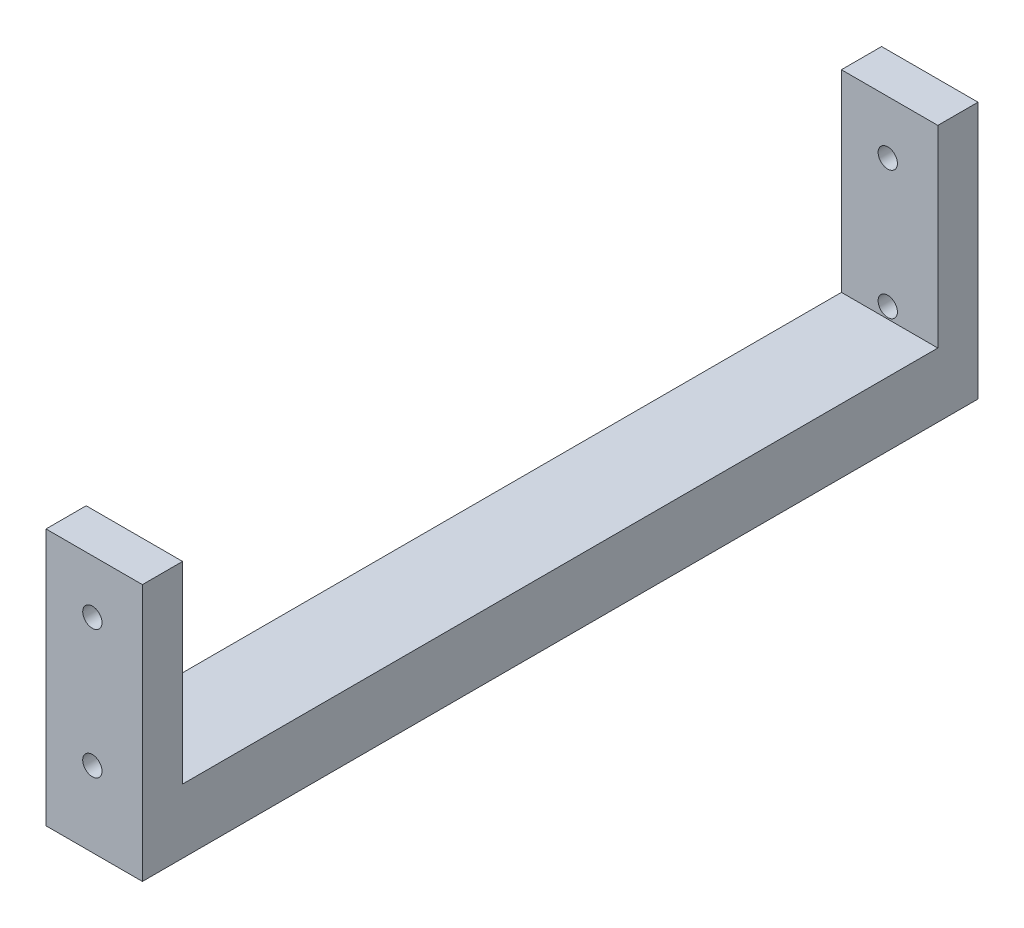
ISO-10303-21;
HEADER;
FILE_DESCRIPTION(('STEP AP214'),'2;1');
FILE_NAME('part.step','',(''),(''),'','','');
FILE_SCHEMA(('AUTOMOTIVE_DESIGN { 1 0 10303 214 1 1 1 1 }'));
ENDSEC;
DATA;
#1=APPLICATION_CONTEXT('core data for automotive mechanical design processes');
#2=APPLICATION_PROTOCOL_DEFINITION('international standard','automotive_design',2000,#1);
#3=PRODUCT_CONTEXT('',#1,'mechanical');
#4=PRODUCT('Part','Part','',(#3));
#5=PRODUCT_RELATED_PRODUCT_CATEGORY('part','',(#4));
#6=PRODUCT_DEFINITION_FORMATION('','',#4);
#7=PRODUCT_DEFINITION_CONTEXT('part definition',#1,'design');
#8=PRODUCT_DEFINITION('design','',#6,#7);
#9=PRODUCT_DEFINITION_SHAPE('','',#8);
#10=(LENGTH_UNIT() NAMED_UNIT(*) SI_UNIT(.MILLI.,.METRE.));
#11=(NAMED_UNIT(*) PLANE_ANGLE_UNIT() SI_UNIT($,.RADIAN.));
#12=(NAMED_UNIT(*) SI_UNIT($,.STERADIAN.) SOLID_ANGLE_UNIT());
#13=UNCERTAINTY_MEASURE_WITH_UNIT(LENGTH_MEASURE(1.E-05),#10,'distance_accuracy_value','');
#14=(GEOMETRIC_REPRESENTATION_CONTEXT(3) GLOBAL_UNCERTAINTY_ASSIGNED_CONTEXT((#13)) GLOBAL_UNIT_ASSIGNED_CONTEXT((#10,
#11,#12)) REPRESENTATION_CONTEXT('',''));
#15=CARTESIAN_POINT('',(0.,0.,0.));
#16=DIRECTION('',(0.,0.,1.));
#17=DIRECTION('',(1.,0.,0.));
#18=AXIS2_PLACEMENT_3D('',#15,#16,#17);
#19=CARTESIAN_POINT('',(-7.5,25.,130.));
#20=DIRECTION('',(0.,-1.,0.));
#21=DIRECTION('',(0.,0.,-1.));
#22=AXIS2_PLACEMENT_3D('',#19,#20,#21);
#23=PLANE('',#22);
#24=DIRECTION('',(0.,0.,-1.));
#25=VECTOR('',#24,1.);
#26=CARTESIAN_POINT('',(-7.5,25.,130.));
#27=LINE('',#26,#25);
#28=CARTESIAN_POINT('',(-7.5,25.,6.25000000000001));
#29=VERTEX_POINT('',#28);
#30=CARTESIAN_POINT('',(-7.5,25.,0.));
#31=VERTEX_POINT('',#30);
#32=EDGE_CURVE('E87',#29,#31,#27,.T.);
#33=ORIENTED_EDGE('',*,*,#32,.F.);
#34=DIRECTION('',(-1.,0.,0.));
#35=VECTOR('',#34,1.);
#36=CARTESIAN_POINT('',(-7.5,25.,6.25000000000001));
#37=LINE('',#36,#35);
#38=CARTESIAN_POINT('',(7.5,25.,6.25000000000001));
#39=VERTEX_POINT('',#38);
#40=EDGE_CURVE('E129',#39,#29,#37,.T.);
#41=ORIENTED_EDGE('',*,*,#40,.F.);
#42=DIRECTION('',(0.,0.,-1.));
#43=VECTOR('',#42,1.);
#44=CARTESIAN_POINT('',(7.5,25.,130.));
#45=LINE('',#44,#43);
#46=CARTESIAN_POINT('',(7.5,25.,0.));
#47=VERTEX_POINT('',#46);
#48=EDGE_CURVE('E157',#39,#47,#45,.T.);
#49=ORIENTED_EDGE('',*,*,#48,.T.);
#50=DIRECTION('',(-1.,0.,0.));
#51=VECTOR('',#50,1.);
#52=CARTESIAN_POINT('',(-7.5,25.,0.));
#53=LINE('',#52,#51);
#54=EDGE_CURVE('E142',#47,#31,#53,.T.);
#55=ORIENTED_EDGE('',*,*,#54,.T.);
#56=EDGE_LOOP('',(#33,#41,#49,#55));
#57=FACE_BOUND('',#56,.T.);
#58=ADVANCED_FACE('F39',(#57),#23,.F.);
#59=CARTESIAN_POINT('',(-7.5,25.,130.));
#60=DIRECTION('',(1.,0.,0.));
#61=DIRECTION('',(0.,1.,0.));
#62=AXIS2_PLACEMENT_3D('',#59,#60,#61);
#63=PLANE('',#62);
#64=DIRECTION('',(0.,0.,1.));
#65=VECTOR('',#64,1.);
#66=CARTESIAN_POINT('',(-7.5,-5.,6.25000000000001));
#67=LINE('',#66,#65);
#68=CARTESIAN_POINT('',(-7.5,-5.,6.25000000000001));
#69=VERTEX_POINT('',#68);
#70=CARTESIAN_POINT('',(-7.49999999999999,-5.,123.75));
#71=VERTEX_POINT('',#70);
#72=EDGE_CURVE('E122',#69,#71,#67,.T.);
#73=ORIENTED_EDGE('',*,*,#72,.F.);
#74=DIRECTION('',(0.,1.,0.));
#75=VECTOR('',#74,1.);
#76=CARTESIAN_POINT('',(-7.5,-5.,6.25000000000001));
#77=LINE('',#76,#75);
#78=EDGE_CURVE('E150',#69,#29,#77,.T.);
#79=ORIENTED_EDGE('',*,*,#78,.T.);
#80=ORIENTED_EDGE('',*,*,#32,.T.);
#81=DIRECTION('',(0.,-1.,0.));
#82=VECTOR('',#81,1.);
#83=CARTESIAN_POINT('',(-7.5,25.,0.));
#84=LINE('',#83,#82);
#85=CARTESIAN_POINT('',(-7.5,-15.,0.));
#86=VERTEX_POINT('',#85);
#87=EDGE_CURVE('E147',#31,#86,#84,.T.);
#88=ORIENTED_EDGE('',*,*,#87,.T.);
#89=DIRECTION('',(0.,0.,-1.));
#90=VECTOR('',#89,1.);
#91=CARTESIAN_POINT('',(-7.5,-15.,130.));
#92=LINE('',#91,#90);
#93=CARTESIAN_POINT('',(-7.5,-15.,130.));
#94=VERTEX_POINT('',#93);
#95=EDGE_CURVE('E11',#94,#86,#92,.T.);
#96=ORIENTED_EDGE('',*,*,#95,.F.);
#97=DIRECTION('',(0.,-1.,0.));
#98=VECTOR('',#97,1.);
#99=CARTESIAN_POINT('',(-7.5,25.,130.));
#100=LINE('',#99,#98);
#101=CARTESIAN_POINT('',(-7.5,25.,130.));
#102=VERTEX_POINT('',#101);
#103=EDGE_CURVE('E140',#102,#94,#100,.T.);
#104=ORIENTED_EDGE('',*,*,#103,.F.);
#105=CARTESIAN_POINT('',(-7.5,25.,123.75));
#106=VERTEX_POINT('',#105);
#107=EDGE_CURVE('E133',#102,#106,#27,.T.);
#108=ORIENTED_EDGE('',*,*,#107,.T.);
#109=DIRECTION('',(0.,1.,0.));
#110=VECTOR('',#109,1.);
#111=CARTESIAN_POINT('',(-7.49999999999999,-5.,123.75));
#112=LINE('',#111,#110);
#113=EDGE_CURVE('E56',#71,#106,#112,.T.);
#114=ORIENTED_EDGE('',*,*,#113,.F.);
#115=EDGE_LOOP('',(#73,#79,#80,#88,#96,#104,#108,#114));
#116=FACE_BOUND('',#115,.T.);
#117=ADVANCED_FACE('F41',(#116),#63,.F.);
#118=CARTESIAN_POINT('',(-7.5,-15.,130.));
#119=DIRECTION('',(0.,1.,0.));
#120=DIRECTION('',(0.,0.,1.));
#121=AXIS2_PLACEMENT_3D('',#118,#119,#120);
#122=PLANE('',#121);
#123=DIRECTION('',(1.,0.,0.));
#124=VECTOR('',#123,1.);
#125=CARTESIAN_POINT('',(-7.5,-15.,0.));
#126=LINE('',#125,#124);
#127=CARTESIAN_POINT('',(7.5,-15.,0.));
#128=VERTEX_POINT('',#127);
#129=EDGE_CURVE('E149',#86,#128,#126,.T.);
#130=ORIENTED_EDGE('',*,*,#129,.T.);
#131=DIRECTION('',(0.,0.,-1.));
#132=VECTOR('',#131,1.);
#133=CARTESIAN_POINT('',(7.5,-15.,130.));
#134=LINE('',#133,#132);
#135=CARTESIAN_POINT('',(7.5,-15.,130.));
#136=VERTEX_POINT('',#135);
#137=EDGE_CURVE('E48',#136,#128,#134,.T.);
#138=ORIENTED_EDGE('',*,*,#137,.F.);
#139=DIRECTION('',(1.,0.,0.));
#140=VECTOR('',#139,1.);
#141=CARTESIAN_POINT('',(-7.5,-15.,130.));
#142=LINE('',#141,#140);
#143=EDGE_CURVE('E94',#94,#136,#142,.T.);
#144=ORIENTED_EDGE('',*,*,#143,.F.);
#145=ORIENTED_EDGE('',*,*,#95,.T.);
#146=EDGE_LOOP('',(#130,#138,#144,#145));
#147=FACE_BOUND('',#146,.T.);
#148=ADVANCED_FACE('F206',(#147),#122,.F.);
#149=CARTESIAN_POINT('',(7.5,25.,130.));
#150=DIRECTION('',(-1.,0.,0.));
#151=DIRECTION('',(0.,-1.,0.));
#152=AXIS2_PLACEMENT_3D('',#149,#150,#151);
#153=PLANE('',#152);
#154=ORIENTED_EDGE('',*,*,#48,.F.);
#155=DIRECTION('',(0.,1.,0.));
#156=VECTOR('',#155,1.);
#157=CARTESIAN_POINT('',(7.5,-5.,6.25000000000001));
#158=LINE('',#157,#156);
#159=CARTESIAN_POINT('',(7.5,-5.,6.25000000000001));
#160=VERTEX_POINT('',#159);
#161=EDGE_CURVE('E135',#160,#39,#158,.T.);
#162=ORIENTED_EDGE('',*,*,#161,.F.);
#163=DIRECTION('',(0.,0.,-1.));
#164=VECTOR('',#163,1.);
#165=CARTESIAN_POINT('',(7.5,-5.,6.25000000000001));
#166=LINE('',#165,#164);
#167=CARTESIAN_POINT('',(7.5,-5.,123.75));
#168=VERTEX_POINT('',#167);
#169=EDGE_CURVE('E121',#168,#160,#166,.T.);
#170=ORIENTED_EDGE('',*,*,#169,.F.);
#171=DIRECTION('',(0.,1.,0.));
#172=VECTOR('',#171,1.);
#173=CARTESIAN_POINT('',(7.5,-5.,123.75));
#174=LINE('',#173,#172);
#175=CARTESIAN_POINT('',(7.5,25.,123.75));
#176=VERTEX_POINT('',#175);
#177=EDGE_CURVE('E118',#168,#176,#174,.T.);
#178=ORIENTED_EDGE('',*,*,#177,.T.);
#179=CARTESIAN_POINT('',(7.5,25.,130.));
#180=VERTEX_POINT('',#179);
#181=EDGE_CURVE('E158',#180,#176,#45,.T.);
#182=ORIENTED_EDGE('',*,*,#181,.F.);
#183=DIRECTION('',(0.,1.,0.));
#184=VECTOR('',#183,1.);
#185=CARTESIAN_POINT('',(7.5,25.,130.));
#186=LINE('',#185,#184);
#187=EDGE_CURVE('E144',#136,#180,#186,.T.);
#188=ORIENTED_EDGE('',*,*,#187,.F.);
#189=ORIENTED_EDGE('',*,*,#137,.T.);
#190=DIRECTION('',(0.,1.,0.));
#191=VECTOR('',#190,1.);
#192=CARTESIAN_POINT('',(7.5,25.,0.));
#193=LINE('',#192,#191);
#194=EDGE_CURVE('E152',#128,#47,#193,.T.);
#195=ORIENTED_EDGE('',*,*,#194,.T.);
#196=EDGE_LOOP('',(#154,#162,#170,#178,#182,#188,#189,#195));
#197=FACE_BOUND('',#196,.T.);
#198=ADVANCED_FACE('F198',(#197),#153,.F.);
#199=ORIENTED_EDGE('',*,*,#181,.T.);
#200=DIRECTION('',(1.,0.,0.));
#201=VECTOR('',#200,1.);
#202=CARTESIAN_POINT('',(-7.49999999999999,25.,123.75));
#203=LINE('',#202,#201);
#204=EDGE_CURVE('E186',#106,#176,#203,.T.);
#205=ORIENTED_EDGE('',*,*,#204,.F.);
#206=ORIENTED_EDGE('',*,*,#107,.F.);
#207=DIRECTION('',(-1.,0.,0.));
#208=VECTOR('',#207,1.);
#209=CARTESIAN_POINT('',(-7.5,25.,130.));
#210=LINE('',#209,#208);
#211=EDGE_CURVE('E65',#180,#102,#210,.T.);
#212=ORIENTED_EDGE('',*,*,#211,.F.);
#213=EDGE_LOOP('',(#199,#205,#206,#212));
#214=FACE_BOUND('',#213,.T.);
#215=ADVANCED_FACE('F210',(#214),#23,.F.);
#216=CARTESIAN_POINT('',(0.,0.,130.));
#217=DIRECTION('',(0.,0.,1.));
#218=DIRECTION('',(1.,0.,0.));
#219=AXIS2_PLACEMENT_3D('',#216,#217,#218);
#220=PLANE('',#219);
#221=CARTESIAN_POINT('',(-0.289357029762211,16.7165887011363,130.));
#222=DIRECTION('',(0.,0.,-1.));
#223=DIRECTION('',(-1.,0.,0.));
#224=AXIS2_PLACEMENT_3D('',#221,#222,#223);
#225=CIRCLE('',#224,1.49999999999999);
#226=CARTESIAN_POINT('',(-1.7893570297622,16.7165887011363,130.));
#227=VERTEX_POINT('',#226);
#228=EDGE_CURVE('E165',#227,#227,#225,.T.);
#229=ORIENTED_EDGE('',*,*,#228,.T.);
#230=EDGE_LOOP('',(#229));
#231=FACE_BOUND('',#230,.T.);
#232=CARTESIAN_POINT('',(-0.289357029762211,-3.28341129886374,130.));
#233=DIRECTION('',(0.,0.,-1.));
#234=DIRECTION('',(-1.,0.,0.));
#235=AXIS2_PLACEMENT_3D('',#232,#233,#234);
#236=CIRCLE('',#235,1.5);
#237=CARTESIAN_POINT('',(-1.78935702976221,-3.28341129886374,130.));
#238=VERTEX_POINT('',#237);
#239=EDGE_CURVE('E172',#238,#238,#236,.T.);
#240=ORIENTED_EDGE('',*,*,#239,.T.);
#241=EDGE_LOOP('',(#240));
#242=FACE_BOUND('',#241,.T.);
#243=ORIENTED_EDGE('',*,*,#103,.T.);
#244=ORIENTED_EDGE('',*,*,#143,.T.);
#245=ORIENTED_EDGE('',*,*,#187,.T.);
#246=ORIENTED_EDGE('',*,*,#211,.T.);
#247=EDGE_LOOP('',(#243,#244,#245,#246));
#248=FACE_BOUND('',#247,.T.);
#249=ADVANCED_FACE('F208',(#231,#242,#248),#220,.T.);
#250=CARTESIAN_POINT('',(0.,0.,0.));
#251=DIRECTION('',(0.,0.,1.));
#252=DIRECTION('',(1.,0.,0.));
#253=AXIS2_PLACEMENT_3D('',#250,#251,#252);
#254=PLANE('',#253);
#255=CARTESIAN_POINT('',(-0.289357029762211,16.7165887011363,0.));
#256=DIRECTION('',(0.,0.,1.));
#257=DIRECTION('',(1.,0.,0.));
#258=AXIS2_PLACEMENT_3D('',#255,#256,#257);
#259=CIRCLE('',#258,1.49999999999999);
#260=CARTESIAN_POINT('',(1.21064297023778,16.7165887011363,0.));
#261=VERTEX_POINT('',#260);
#262=EDGE_CURVE('E184',#261,#261,#259,.T.);
#263=ORIENTED_EDGE('',*,*,#262,.T.);
#264=EDGE_LOOP('',(#263));
#265=FACE_BOUND('',#264,.T.);
#266=CARTESIAN_POINT('',(-0.289357029762211,-3.28341129886374,0.));
#267=DIRECTION('',(0.,0.,1.));
#268=DIRECTION('',(1.,0.,0.));
#269=AXIS2_PLACEMENT_3D('',#266,#267,#268);
#270=CIRCLE('',#269,1.5);
#271=CARTESIAN_POINT('',(1.21064297023779,-3.28341129886374,0.));
#272=VERTEX_POINT('',#271);
#273=EDGE_CURVE('E169',#272,#272,#270,.T.);
#274=ORIENTED_EDGE('',*,*,#273,.T.);
#275=EDGE_LOOP('',(#274));
#276=FACE_BOUND('',#275,.T.);
#277=ORIENTED_EDGE('',*,*,#87,.F.);
#278=ORIENTED_EDGE('',*,*,#54,.F.);
#279=ORIENTED_EDGE('',*,*,#194,.F.);
#280=ORIENTED_EDGE('',*,*,#129,.F.);
#281=EDGE_LOOP('',(#277,#278,#279,#280));
#282=FACE_BOUND('',#281,.T.);
#283=ADVANCED_FACE('F204',(#265,#276,#282),#254,.F.);
#284=CARTESIAN_POINT('',(-7.5,-5.,6.25000000000001));
#285=DIRECTION('',(0.,0.,-1.));
#286=DIRECTION('',(-1.,0.,0.));
#287=AXIS2_PLACEMENT_3D('',#284,#285,#286);
#288=PLANE('',#287);
#289=CARTESIAN_POINT('',(-0.289357029762211,16.7165887011363,6.25000000000001));
#290=DIRECTION('',(0.,0.,-1.));
#291=DIRECTION('',(-1.,0.,0.));
#292=AXIS2_PLACEMENT_3D('',#289,#290,#291);
#293=CIRCLE('',#292,1.49999999999999);
#294=CARTESIAN_POINT('',(-1.7893570297622,16.7165887011363,6.25000000000001));
#295=VERTEX_POINT('',#294);
#296=EDGE_CURVE('E181',#295,#295,#293,.T.);
#297=ORIENTED_EDGE('',*,*,#296,.T.);
#298=EDGE_LOOP('',(#297));
#299=FACE_BOUND('',#298,.T.);
#300=CARTESIAN_POINT('',(-0.289357029762211,-3.28341129886374,6.25000000000001));
#301=DIRECTION('',(0.,0.,-1.));
#302=DIRECTION('',(-1.,0.,0.));
#303=AXIS2_PLACEMENT_3D('',#300,#301,#302);
#304=CIRCLE('',#303,1.5);
#305=CARTESIAN_POINT('',(-1.78935702976221,-3.28341129886374,6.25000000000001));
#306=VERTEX_POINT('',#305);
#307=EDGE_CURVE('E164',#306,#306,#304,.T.);
#308=ORIENTED_EDGE('',*,*,#307,.T.);
#309=EDGE_LOOP('',(#308));
#310=FACE_BOUND('',#309,.T.);
#311=ORIENTED_EDGE('',*,*,#40,.T.);
#312=ORIENTED_EDGE('',*,*,#78,.F.);
#313=DIRECTION('',(-1.,0.,0.));
#314=VECTOR('',#313,1.);
#315=CARTESIAN_POINT('',(-7.5,-5.,6.25000000000001));
#316=LINE('',#315,#314);
#317=EDGE_CURVE('E128',#160,#69,#316,.T.);
#318=ORIENTED_EDGE('',*,*,#317,.F.);
#319=ORIENTED_EDGE('',*,*,#161,.T.);
#320=EDGE_LOOP('',(#311,#312,#318,#319));
#321=FACE_BOUND('',#320,.T.);
#322=ADVANCED_FACE('F194',(#299,#310,#321),#288,.F.);
#323=CARTESIAN_POINT('',(-7.49999999999999,-5.,123.75));
#324=DIRECTION('',(0.,0.,1.));
#325=DIRECTION('',(1.,0.,0.));
#326=AXIS2_PLACEMENT_3D('',#323,#324,#325);
#327=PLANE('',#326);
#328=CARTESIAN_POINT('',(-0.289357029762211,16.7165887011363,123.75));
#329=DIRECTION('',(0.,0.,1.));
#330=DIRECTION('',(1.,0.,0.));
#331=AXIS2_PLACEMENT_3D('',#328,#329,#330);
#332=CIRCLE('',#331,1.49999999999999);
#333=CARTESIAN_POINT('',(1.21064297023778,16.7165887011363,123.75));
#334=VERTEX_POINT('',#333);
#335=EDGE_CURVE('E43',#334,#334,#332,.T.);
#336=ORIENTED_EDGE('',*,*,#335,.T.);
#337=EDGE_LOOP('',(#336));
#338=FACE_BOUND('',#337,.T.);
#339=CARTESIAN_POINT('',(-0.289357029762211,-3.28341129886374,123.75));
#340=DIRECTION('',(0.,0.,1.));
#341=DIRECTION('',(1.,0.,0.));
#342=AXIS2_PLACEMENT_3D('',#339,#340,#341);
#343=CIRCLE('',#342,1.5);
#344=CARTESIAN_POINT('',(1.21064297023779,-3.28341129886374,123.75));
#345=VERTEX_POINT('',#344);
#346=EDGE_CURVE('E162',#345,#345,#343,.T.);
#347=ORIENTED_EDGE('',*,*,#346,.T.);
#348=EDGE_LOOP('',(#347));
#349=FACE_BOUND('',#348,.T.);
#350=ORIENTED_EDGE('',*,*,#204,.T.);
#351=ORIENTED_EDGE('',*,*,#177,.F.);
#352=DIRECTION('',(1.,0.,0.));
#353=VECTOR('',#352,1.);
#354=CARTESIAN_POINT('',(-7.49999999999999,-5.,123.75));
#355=LINE('',#354,#353);
#356=EDGE_CURVE('E114',#71,#168,#355,.T.);
#357=ORIENTED_EDGE('',*,*,#356,.F.);
#358=ORIENTED_EDGE('',*,*,#113,.T.);
#359=EDGE_LOOP('',(#350,#351,#357,#358));
#360=FACE_BOUND('',#359,.T.);
#361=ADVANCED_FACE('F116',(#338,#349,#360),#327,.F.);
#362=CARTESIAN_POINT('',(0.,-5.,0.));
#363=DIRECTION('',(0.,1.,0.));
#364=DIRECTION('',(0.,0.,1.));
#365=AXIS2_PLACEMENT_3D('',#362,#363,#364);
#366=PLANE('',#365);
#367=ORIENTED_EDGE('',*,*,#72,.T.);
#368=ORIENTED_EDGE('',*,*,#356,.T.);
#369=ORIENTED_EDGE('',*,*,#169,.T.);
#370=ORIENTED_EDGE('',*,*,#317,.T.);
#371=EDGE_LOOP('',(#367,#368,#369,#370));
#372=FACE_BOUND('',#371,.T.);
#373=ADVANCED_FACE('F126',(#372),#366,.T.);
#374=CARTESIAN_POINT('',(-0.289357029762211,-3.28341129886374,130.));
#375=DIRECTION('',(0.,0.,-1.));
#376=DIRECTION('',(-1.,0.,0.));
#377=AXIS2_PLACEMENT_3D('',#374,#375,#376);
#378=CYLINDRICAL_SURFACE('',#377,1.5);
#379=ORIENTED_EDGE('',*,*,#239,.F.);
#380=EDGE_LOOP('',(#379));
#381=FACE_BOUND('',#380,.T.);
#382=ORIENTED_EDGE('',*,*,#346,.F.);
#383=EDGE_LOOP('',(#382));
#384=FACE_BOUND('',#383,.T.);
#385=ADVANCED_FACE('F289',(#381,#384),#378,.F.);
#386=CARTESIAN_POINT('',(-0.289357029762211,16.7165887011363,130.));
#387=DIRECTION('',(0.,0.,-1.));
#388=DIRECTION('',(-1.,0.,0.));
#389=AXIS2_PLACEMENT_3D('',#386,#387,#388);
#390=CYLINDRICAL_SURFACE('',#389,1.49999999999999);
#391=ORIENTED_EDGE('',*,*,#228,.F.);
#392=EDGE_LOOP('',(#391));
#393=FACE_BOUND('',#392,.T.);
#394=ORIENTED_EDGE('',*,*,#335,.F.);
#395=EDGE_LOOP('',(#394));
#396=FACE_BOUND('',#395,.T.);
#397=ADVANCED_FACE('F297',(#393,#396),#390,.F.);
#398=ORIENTED_EDGE('',*,*,#307,.F.);
#399=EDGE_LOOP('',(#398));
#400=FACE_BOUND('',#399,.T.);
#401=ORIENTED_EDGE('',*,*,#273,.F.);
#402=EDGE_LOOP('',(#401));
#403=FACE_BOUND('',#402,.T.);
#404=ADVANCED_FACE('F300',(#400,#403),#378,.F.);
#405=ORIENTED_EDGE('',*,*,#296,.F.);
#406=EDGE_LOOP('',(#405));
#407=FACE_BOUND('',#406,.T.);
#408=ORIENTED_EDGE('',*,*,#262,.F.);
#409=EDGE_LOOP('',(#408));
#410=FACE_BOUND('',#409,.T.);
#411=ADVANCED_FACE('F310',(#407,#410),#390,.F.);
#412=CLOSED_SHELL('',(#58,#117,#148,#198,#215,#249,#283,#322,#361,#373,#385,#397,#404,#411));
#413=MANIFOLD_SOLID_BREP('B2',#412);
#414=ADVANCED_BREP_SHAPE_REPRESENTATION('',(#18,#413),#14);
#415=SHAPE_DEFINITION_REPRESENTATION(#9,#414);
ENDSEC;
END-ISO-10303-21;
